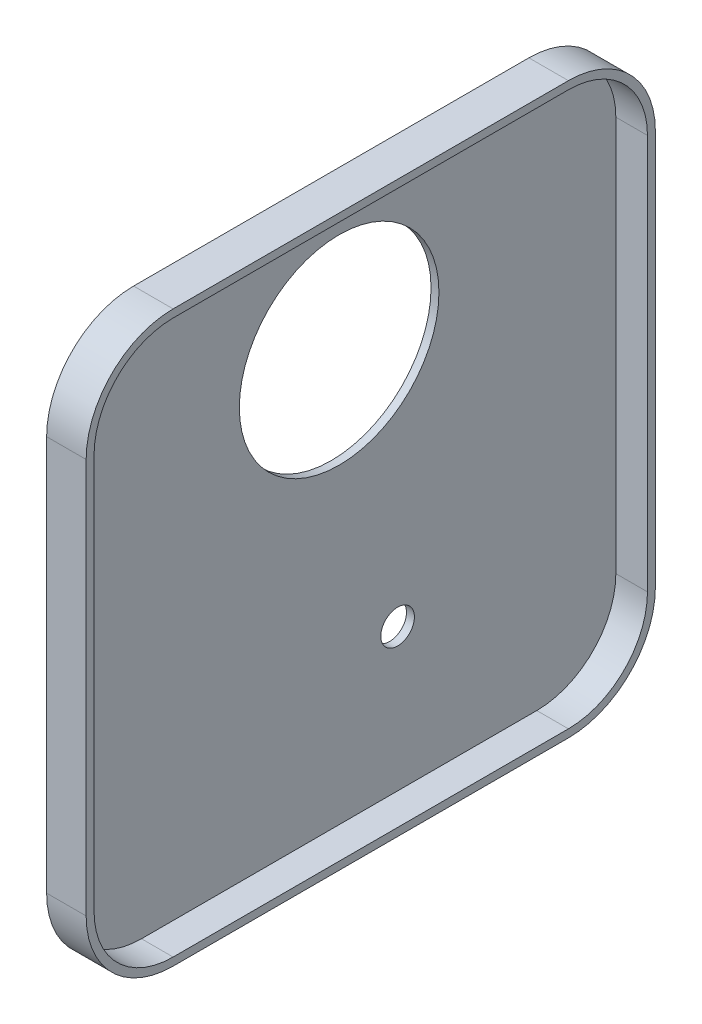
ISO-10303-21;
HEADER;
FILE_DESCRIPTION(('STEP AP214'),'2;1');
FILE_NAME('part.step','',(''),(''),'','','');
FILE_SCHEMA(('AUTOMOTIVE_DESIGN { 1 0 10303 214 1 1 1 1 }'));
ENDSEC;
DATA;
#1=APPLICATION_CONTEXT('core data for automotive mechanical design processes');
#2=APPLICATION_PROTOCOL_DEFINITION('international standard','automotive_design',2000,#1);
#3=PRODUCT_CONTEXT('',#1,'mechanical');
#4=PRODUCT('Part','Part','',(#3));
#5=PRODUCT_RELATED_PRODUCT_CATEGORY('part','',(#4));
#6=PRODUCT_DEFINITION_FORMATION('','',#4);
#7=PRODUCT_DEFINITION_CONTEXT('part definition',#1,'design');
#8=PRODUCT_DEFINITION('design','',#6,#7);
#9=PRODUCT_DEFINITION_SHAPE('','',#8);
#10=(LENGTH_UNIT() NAMED_UNIT(*) SI_UNIT(.MILLI.,.METRE.));
#11=(NAMED_UNIT(*) PLANE_ANGLE_UNIT() SI_UNIT($,.RADIAN.));
#12=(NAMED_UNIT(*) SI_UNIT($,.STERADIAN.) SOLID_ANGLE_UNIT());
#13=UNCERTAINTY_MEASURE_WITH_UNIT(LENGTH_MEASURE(1.E-05),#10,'distance_accuracy_value','');
#14=(GEOMETRIC_REPRESENTATION_CONTEXT(3) GLOBAL_UNCERTAINTY_ASSIGNED_CONTEXT((#13)) GLOBAL_UNIT_ASSIGNED_CONTEXT((#10,
#11,#12)) REPRESENTATION_CONTEXT('',''));
#15=CARTESIAN_POINT('',(0.,0.,0.));
#16=DIRECTION('',(0.,0.,1.));
#17=DIRECTION('',(1.,0.,0.));
#18=AXIS2_PLACEMENT_3D('',#15,#16,#17);
#19=CARTESIAN_POINT('',(10.,34.,0.));
#20=DIRECTION('',(-1.,0.,0.));
#21=DIRECTION('',(0.,0.,1.));
#22=AXIS2_PLACEMENT_3D('',#19,#20,#21);
#23=CYLINDRICAL_SURFACE('',#22,25.25);
#24=CARTESIAN_POINT('',(0.,34.,0.));
#25=DIRECTION('',(1.,0.,0.));
#26=DIRECTION('',(0.,0.,-1.));
#27=AXIS2_PLACEMENT_3D('',#24,#25,#26);
#28=CIRCLE('',#27,25.25);
#29=CARTESIAN_POINT('',(0.,34.,-25.25));
#30=VERTEX_POINT('',#29);
#31=EDGE_CURVE('E163',#30,#30,#28,.T.);
#32=ORIENTED_EDGE('',*,*,#31,.F.);
#33=EDGE_LOOP('',(#32));
#34=FACE_BOUND('',#33,.T.);
#35=CARTESIAN_POINT('',(2.,34.,0.));
#36=DIRECTION('',(1.,0.,0.));
#37=DIRECTION('',(0.,0.,-1.));
#38=AXIS2_PLACEMENT_3D('',#35,#36,#37);
#39=CIRCLE('',#38,25.25);
#40=CARTESIAN_POINT('',(2.,34.,-25.25));
#41=VERTEX_POINT('',#40);
#42=EDGE_CURVE('E326',#41,#41,#39,.T.);
#43=ORIENTED_EDGE('',*,*,#42,.T.);
#44=EDGE_LOOP('',(#43));
#45=FACE_BOUND('',#44,.T.);
#46=ADVANCED_FACE('F45',(#34,#45),#23,.F.);
#47=CARTESIAN_POINT('',(10.,-34.,-14.79));
#48=DIRECTION('',(-1.,0.,0.));
#49=DIRECTION('',(0.,0.,1.));
#50=AXIS2_PLACEMENT_3D('',#47,#48,#49);
#51=CYLINDRICAL_SURFACE('',#50,4.25);
#52=CARTESIAN_POINT('',(0.,-34.,-14.79));
#53=DIRECTION('',(1.,0.,0.));
#54=DIRECTION('',(0.,0.,-1.));
#55=AXIS2_PLACEMENT_3D('',#52,#53,#54);
#56=CIRCLE('',#55,4.25);
#57=CARTESIAN_POINT('',(0.,-34.,-19.04));
#58=VERTEX_POINT('',#57);
#59=EDGE_CURVE('E230',#58,#58,#56,.T.);
#60=ORIENTED_EDGE('',*,*,#59,.F.);
#61=EDGE_LOOP('',(#60));
#62=FACE_BOUND('',#61,.T.);
#63=CARTESIAN_POINT('',(2.,-34.,-14.79));
#64=DIRECTION('',(1.,0.,0.));
#65=DIRECTION('',(0.,0.,-1.));
#66=AXIS2_PLACEMENT_3D('',#63,#64,#65);
#67=CIRCLE('',#66,4.25);
#68=CARTESIAN_POINT('',(2.,-34.,-19.04));
#69=VERTEX_POINT('',#68);
#70=EDGE_CURVE('E330',#69,#69,#67,.T.);
#71=ORIENTED_EDGE('',*,*,#70,.T.);
#72=EDGE_LOOP('',(#71));
#73=FACE_BOUND('',#72,.T.);
#74=ADVANCED_FACE('F335',(#62,#73),#51,.F.);
#75=CARTESIAN_POINT('',(10.,-49.9999999999999,50.));
#76=DIRECTION('',(-1.,0.,0.));
#77=DIRECTION('',(0.,0.,1.));
#78=AXIS2_PLACEMENT_3D('',#75,#76,#77);
#79=PLANE('',#78);
#80=CARTESIAN_POINT('',(10.,-49.9999999999999,50.));
#81=DIRECTION('',(-1.,0.,0.));
#82=DIRECTION('',(0.,0.,1.));
#83=AXIS2_PLACEMENT_3D('',#80,#81,#82);
#84=CIRCLE('',#83,20.);
#85=CARTESIAN_POINT('',(10.,-49.9999999999999,70.));
#86=VERTEX_POINT('',#85);
#87=CARTESIAN_POINT('',(10.,-69.9999999999999,50.));
#88=VERTEX_POINT('',#87);
#89=EDGE_CURVE('E262',#86,#88,#84,.F.);
#90=ORIENTED_EDGE('',*,*,#89,.F.);
#91=DIRECTION('',(0.,-1.,0.));
#92=VECTOR('',#91,1.);
#93=CARTESIAN_POINT('',(10.,-49.9999999999999,70.));
#94=LINE('',#93,#92);
#95=CARTESIAN_POINT('',(10.,50.,70.));
#96=VERTEX_POINT('',#95);
#97=EDGE_CURVE('E235',#96,#86,#94,.T.);
#98=ORIENTED_EDGE('',*,*,#97,.F.);
#99=CARTESIAN_POINT('',(10.,50.,50.));
#100=DIRECTION('',(-1.,0.,0.));
#101=DIRECTION('',(0.,0.,1.));
#102=AXIS2_PLACEMENT_3D('',#99,#100,#101);
#103=CIRCLE('',#102,20.);
#104=CARTESIAN_POINT('',(10.,70.,50.));
#105=VERTEX_POINT('',#104);
#106=EDGE_CURVE('E239',#105,#96,#103,.F.);
#107=ORIENTED_EDGE('',*,*,#106,.F.);
#108=DIRECTION('',(0.,0.,1.));
#109=VECTOR('',#108,1.);
#110=CARTESIAN_POINT('',(10.,70.,50.));
#111=LINE('',#110,#109);
#112=CARTESIAN_POINT('',(10.,70.,-50.));
#113=VERTEX_POINT('',#112);
#114=EDGE_CURVE('E242',#113,#105,#111,.T.);
#115=ORIENTED_EDGE('',*,*,#114,.F.);
#116=CARTESIAN_POINT('',(10.,50.,-50.));
#117=DIRECTION('',(-1.,0.,0.));
#118=DIRECTION('',(0.,0.,1.));
#119=AXIS2_PLACEMENT_3D('',#116,#117,#118);
#120=CIRCLE('',#119,20.);
#121=CARTESIAN_POINT('',(10.,50.,-70.));
#122=VERTEX_POINT('',#121);
#123=EDGE_CURVE('E246',#122,#113,#120,.F.);
#124=ORIENTED_EDGE('',*,*,#123,.F.);
#125=DIRECTION('',(0.,1.,0.));
#126=VECTOR('',#125,1.);
#127=CARTESIAN_POINT('',(10.,-49.9999999999999,-70.));
#128=LINE('',#127,#126);
#129=CARTESIAN_POINT('',(10.,-49.9999999999999,-70.));
#130=VERTEX_POINT('',#129);
#131=EDGE_CURVE('E250',#130,#122,#128,.T.);
#132=ORIENTED_EDGE('',*,*,#131,.F.);
#133=CARTESIAN_POINT('',(10.,-49.9999999999999,-50.));
#134=DIRECTION('',(-1.,0.,0.));
#135=DIRECTION('',(0.,0.,1.));
#136=AXIS2_PLACEMENT_3D('',#133,#134,#135);
#137=CIRCLE('',#136,20.);
#138=CARTESIAN_POINT('',(10.,-69.9999999999999,-50.));
#139=VERTEX_POINT('',#138);
#140=EDGE_CURVE('E254',#139,#130,#137,.F.);
#141=ORIENTED_EDGE('',*,*,#140,.F.);
#142=DIRECTION('',(0.,0.,-1.));
#143=VECTOR('',#142,1.);
#144=CARTESIAN_POINT('',(10.,-69.9999999999999,50.));
#145=LINE('',#144,#143);
#146=EDGE_CURVE('E258',#88,#139,#145,.T.);
#147=ORIENTED_EDGE('',*,*,#146,.F.);
#148=EDGE_LOOP('',(#90,#98,#107,#115,#124,#132,#141,#147));
#149=FACE_BOUND('',#148,.T.);
#150=CARTESIAN_POINT('',(10.,-49.9999999999999,50.));
#151=DIRECTION('',(1.,0.,0.));
#152=DIRECTION('',(0.,0.,1.));
#153=AXIS2_PLACEMENT_3D('',#150,#151,#152);
#154=CIRCLE('',#153,22.);
#155=CARTESIAN_POINT('',(10.,-49.9999999999999,72.));
#156=VERTEX_POINT('',#155);
#157=CARTESIAN_POINT('',(10.,-71.9999999999999,50.));
#158=VERTEX_POINT('',#157);
#159=EDGE_CURVE('E182',#156,#158,#154,.T.);
#160=ORIENTED_EDGE('',*,*,#159,.T.);
#161=DIRECTION('',(0.,0.,-1.));
#162=VECTOR('',#161,1.);
#163=CARTESIAN_POINT('',(10.,-71.9999999999999,-50.));
#164=LINE('',#163,#162);
#165=CARTESIAN_POINT('',(10.,-71.9999999999999,-50.));
#166=VERTEX_POINT('',#165);
#167=EDGE_CURVE('E111',#158,#166,#164,.T.);
#168=ORIENTED_EDGE('',*,*,#167,.T.);
#169=CARTESIAN_POINT('',(10.,-49.9999999999999,-50.));
#170=DIRECTION('',(1.,0.,0.));
#171=DIRECTION('',(0.,0.,1.));
#172=AXIS2_PLACEMENT_3D('',#169,#170,#171);
#173=CIRCLE('',#172,22.);
#174=CARTESIAN_POINT('',(10.,-49.9999999999999,-72.));
#175=VERTEX_POINT('',#174);
#176=EDGE_CURVE('E203',#166,#175,#173,.T.);
#177=ORIENTED_EDGE('',*,*,#176,.T.);
#178=DIRECTION('',(0.,1.,0.));
#179=VECTOR('',#178,1.);
#180=CARTESIAN_POINT('',(10.,-49.9999999999999,-72.));
#181=LINE('',#180,#179);
#182=CARTESIAN_POINT('',(10.,50.,-72.));
#183=VERTEX_POINT('',#182);
#184=EDGE_CURVE('E217',#175,#183,#181,.T.);
#185=ORIENTED_EDGE('',*,*,#184,.T.);
#186=CARTESIAN_POINT('',(10.,50.,-50.));
#187=DIRECTION('',(1.,0.,0.));
#188=DIRECTION('',(0.,0.,-1.));
#189=AXIS2_PLACEMENT_3D('',#186,#187,#188);
#190=CIRCLE('',#189,22.);
#191=CARTESIAN_POINT('',(10.,72.,-50.));
#192=VERTEX_POINT('',#191);
#193=EDGE_CURVE('E133',#183,#192,#190,.T.);
#194=ORIENTED_EDGE('',*,*,#193,.T.);
#195=DIRECTION('',(0.,0.,1.));
#196=VECTOR('',#195,1.);
#197=CARTESIAN_POINT('',(10.,72.,-50.));
#198=LINE('',#197,#196);
#199=CARTESIAN_POINT('',(10.,72.,50.));
#200=VERTEX_POINT('',#199);
#201=EDGE_CURVE('E126',#192,#200,#198,.T.);
#202=ORIENTED_EDGE('',*,*,#201,.T.);
#203=CARTESIAN_POINT('',(10.,50.,50.));
#204=DIRECTION('',(1.,0.,0.));
#205=DIRECTION('',(0.,0.,1.));
#206=AXIS2_PLACEMENT_3D('',#203,#204,#205);
#207=CIRCLE('',#206,22.);
#208=CARTESIAN_POINT('',(10.,50.,72.));
#209=VERTEX_POINT('',#208);
#210=EDGE_CURVE('E130',#200,#209,#207,.T.);
#211=ORIENTED_EDGE('',*,*,#210,.T.);
#212=DIRECTION('',(0.,-1.,0.));
#213=VECTOR('',#212,1.);
#214=CARTESIAN_POINT('',(10.,-49.9999999999999,72.));
#215=LINE('',#214,#213);
#216=EDGE_CURVE('E70',#209,#156,#215,.T.);
#217=ORIENTED_EDGE('',*,*,#216,.T.);
#218=EDGE_LOOP('',(#160,#168,#177,#185,#194,#202,#211,#217));
#219=FACE_BOUND('',#218,.T.);
#220=ADVANCED_FACE('F128',(#149,#219),#79,.F.);
#221=CARTESIAN_POINT('',(0.,-49.9999999999999,50.));
#222=DIRECTION('',(-1.,0.,0.));
#223=DIRECTION('',(0.,0.,1.));
#224=AXIS2_PLACEMENT_3D('',#221,#222,#223);
#225=PLANE('',#224);
#226=ORIENTED_EDGE('',*,*,#31,.T.);
#227=EDGE_LOOP('',(#226));
#228=FACE_BOUND('',#227,.T.);
#229=CARTESIAN_POINT('',(0.,-49.9999999999999,50.));
#230=DIRECTION('',(1.,0.,0.));
#231=DIRECTION('',(0.,0.,1.));
#232=AXIS2_PLACEMENT_3D('',#229,#230,#231);
#233=CIRCLE('',#232,22.);
#234=CARTESIAN_POINT('',(0.,-49.9999999999999,72.));
#235=VERTEX_POINT('',#234);
#236=CARTESIAN_POINT('',(0.,-71.9999999999999,50.));
#237=VERTEX_POINT('',#236);
#238=EDGE_CURVE('E158',#235,#237,#233,.T.);
#239=ORIENTED_EDGE('',*,*,#238,.F.);
#240=DIRECTION('',(0.,-1.,0.));
#241=VECTOR('',#240,1.);
#242=CARTESIAN_POINT('',(0.,-49.9999999999999,72.));
#243=LINE('',#242,#241);
#244=CARTESIAN_POINT('',(0.,50.,72.));
#245=VERTEX_POINT('',#244);
#246=EDGE_CURVE('E103',#245,#235,#243,.T.);
#247=ORIENTED_EDGE('',*,*,#246,.F.);
#248=CARTESIAN_POINT('',(0.,50.,50.));
#249=DIRECTION('',(1.,0.,0.));
#250=DIRECTION('',(0.,0.,1.));
#251=AXIS2_PLACEMENT_3D('',#248,#249,#250);
#252=CIRCLE('',#251,22.);
#253=CARTESIAN_POINT('',(0.,72.,50.));
#254=VERTEX_POINT('',#253);
#255=EDGE_CURVE('E177',#254,#245,#252,.T.);
#256=ORIENTED_EDGE('',*,*,#255,.F.);
#257=DIRECTION('',(0.,0.,1.));
#258=VECTOR('',#257,1.);
#259=CARTESIAN_POINT('',(0.,72.,-50.));
#260=LINE('',#259,#258);
#261=CARTESIAN_POINT('',(0.,72.,-50.));
#262=VERTEX_POINT('',#261);
#263=EDGE_CURVE('E143',#262,#254,#260,.T.);
#264=ORIENTED_EDGE('',*,*,#263,.F.);
#265=CARTESIAN_POINT('',(0.,50.,-50.));
#266=DIRECTION('',(1.,0.,0.));
#267=DIRECTION('',(0.,0.,-1.));
#268=AXIS2_PLACEMENT_3D('',#265,#266,#267);
#269=CIRCLE('',#268,22.);
#270=CARTESIAN_POINT('',(0.,50.,-72.));
#271=VERTEX_POINT('',#270);
#272=EDGE_CURVE('E172',#271,#262,#269,.T.);
#273=ORIENTED_EDGE('',*,*,#272,.F.);
#274=DIRECTION('',(0.,1.,0.));
#275=VECTOR('',#274,1.);
#276=CARTESIAN_POINT('',(0.,-49.9999999999999,-72.));
#277=LINE('',#276,#275);
#278=CARTESIAN_POINT('',(0.,-49.9999999999999,-72.));
#279=VERTEX_POINT('',#278);
#280=EDGE_CURVE('E169',#279,#271,#277,.T.);
#281=ORIENTED_EDGE('',*,*,#280,.F.);
#282=CARTESIAN_POINT('',(0.,-49.9999999999999,-50.));
#283=DIRECTION('',(1.,0.,0.));
#284=DIRECTION('',(0.,0.,1.));
#285=AXIS2_PLACEMENT_3D('',#282,#283,#284);
#286=CIRCLE('',#285,22.);
#287=CARTESIAN_POINT('',(0.,-71.9999999999999,-50.));
#288=VERTEX_POINT('',#287);
#289=EDGE_CURVE('E166',#288,#279,#286,.T.);
#290=ORIENTED_EDGE('',*,*,#289,.F.);
#291=DIRECTION('',(0.,0.,-1.));
#292=VECTOR('',#291,1.);
#293=CARTESIAN_POINT('',(0.,-71.9999999999999,-50.));
#294=LINE('',#293,#292);
#295=EDGE_CURVE('E162',#237,#288,#294,.T.);
#296=ORIENTED_EDGE('',*,*,#295,.F.);
#297=EDGE_LOOP('',(#239,#247,#256,#264,#273,#281,#290,#296));
#298=FACE_BOUND('',#297,.T.);
#299=ORIENTED_EDGE('',*,*,#59,.T.);
#300=EDGE_LOOP('',(#299));
#301=FACE_BOUND('',#300,.T.);
#302=ADVANCED_FACE('F207',(#228,#298,#301),#225,.T.);
#303=CARTESIAN_POINT('',(10.,-49.9999999999999,50.));
#304=DIRECTION('',(-1.,0.,0.));
#305=DIRECTION('',(0.,0.,1.));
#306=AXIS2_PLACEMENT_3D('',#303,#304,#305);
#307=CYLINDRICAL_SURFACE('',#306,22.);
#308=ORIENTED_EDGE('',*,*,#238,.T.);
#309=DIRECTION('',(-1.,0.,0.));
#310=VECTOR('',#309,1.);
#311=CARTESIAN_POINT('',(10.,-71.9999999999999,50.));
#312=LINE('',#311,#310);
#313=EDGE_CURVE('E11',#158,#237,#312,.T.);
#314=ORIENTED_EDGE('',*,*,#313,.F.);
#315=ORIENTED_EDGE('',*,*,#159,.F.);
#316=DIRECTION('',(-1.,0.,0.));
#317=VECTOR('',#316,1.);
#318=CARTESIAN_POINT('',(10.,-49.9999999999999,72.));
#319=LINE('',#318,#317);
#320=EDGE_CURVE('E154',#156,#235,#319,.T.);
#321=ORIENTED_EDGE('',*,*,#320,.T.);
#322=EDGE_LOOP('',(#308,#314,#315,#321));
#323=FACE_BOUND('',#322,.T.);
#324=ADVANCED_FACE('F47',(#323),#307,.T.);
#325=CARTESIAN_POINT('',(10.,-71.9999999999999,-50.));
#326=DIRECTION('',(0.,1.,0.));
#327=DIRECTION('',(0.,0.,1.));
#328=AXIS2_PLACEMENT_3D('',#325,#326,#327);
#329=PLANE('',#328);
#330=ORIENTED_EDGE('',*,*,#295,.T.);
#331=DIRECTION('',(-1.,0.,0.));
#332=VECTOR('',#331,1.);
#333=CARTESIAN_POINT('',(10.,-71.9999999999999,-50.));
#334=LINE('',#333,#332);
#335=EDGE_CURVE('E54',#166,#288,#334,.T.);
#336=ORIENTED_EDGE('',*,*,#335,.F.);
#337=ORIENTED_EDGE('',*,*,#167,.F.);
#338=ORIENTED_EDGE('',*,*,#313,.T.);
#339=EDGE_LOOP('',(#330,#336,#337,#338));
#340=FACE_BOUND('',#339,.T.);
#341=ADVANCED_FACE('F375',(#340),#329,.F.);
#342=CARTESIAN_POINT('',(10.,-49.9999999999999,-50.));
#343=DIRECTION('',(-1.,0.,0.));
#344=DIRECTION('',(0.,0.,1.));
#345=AXIS2_PLACEMENT_3D('',#342,#343,#344);
#346=CYLINDRICAL_SURFACE('',#345,22.);
#347=ORIENTED_EDGE('',*,*,#289,.T.);
#348=DIRECTION('',(-1.,0.,0.));
#349=VECTOR('',#348,1.);
#350=CARTESIAN_POINT('',(10.,-49.9999999999999,-72.));
#351=LINE('',#350,#349);
#352=EDGE_CURVE('E193',#175,#279,#351,.T.);
#353=ORIENTED_EDGE('',*,*,#352,.F.);
#354=ORIENTED_EDGE('',*,*,#176,.F.);
#355=ORIENTED_EDGE('',*,*,#335,.T.);
#356=EDGE_LOOP('',(#347,#353,#354,#355));
#357=FACE_BOUND('',#356,.T.);
#358=ADVANCED_FACE('F201',(#357),#346,.T.);
#359=CARTESIAN_POINT('',(10.,-49.9999999999999,-72.));
#360=DIRECTION('',(0.,0.,1.));
#361=DIRECTION('',(1.,0.,0.));
#362=AXIS2_PLACEMENT_3D('',#359,#360,#361);
#363=PLANE('',#362);
#364=ORIENTED_EDGE('',*,*,#280,.T.);
#365=DIRECTION('',(-1.,0.,0.));
#366=VECTOR('',#365,1.);
#367=CARTESIAN_POINT('',(10.,50.,-72.));
#368=LINE('',#367,#366);
#369=EDGE_CURVE('E189',#183,#271,#368,.T.);
#370=ORIENTED_EDGE('',*,*,#369,.F.);
#371=ORIENTED_EDGE('',*,*,#184,.F.);
#372=ORIENTED_EDGE('',*,*,#352,.T.);
#373=EDGE_LOOP('',(#364,#370,#371,#372));
#374=FACE_BOUND('',#373,.T.);
#375=ADVANCED_FACE('F212',(#374),#363,.F.);
#376=CARTESIAN_POINT('',(10.,50.,-50.));
#377=DIRECTION('',(-1.,0.,0.));
#378=DIRECTION('',(0.,0.,1.));
#379=AXIS2_PLACEMENT_3D('',#376,#377,#378);
#380=CYLINDRICAL_SURFACE('',#379,22.);
#381=ORIENTED_EDGE('',*,*,#272,.T.);
#382=DIRECTION('',(-1.,0.,0.));
#383=VECTOR('',#382,1.);
#384=CARTESIAN_POINT('',(10.,72.,-50.));
#385=LINE('',#384,#383);
#386=EDGE_CURVE('E147',#192,#262,#385,.T.);
#387=ORIENTED_EDGE('',*,*,#386,.F.);
#388=ORIENTED_EDGE('',*,*,#193,.F.);
#389=ORIENTED_EDGE('',*,*,#369,.T.);
#390=EDGE_LOOP('',(#381,#387,#388,#389));
#391=FACE_BOUND('',#390,.T.);
#392=ADVANCED_FACE('F215',(#391),#380,.T.);
#393=CARTESIAN_POINT('',(10.,72.,-50.));
#394=DIRECTION('',(0.,-1.,0.));
#395=DIRECTION('',(0.,0.,-1.));
#396=AXIS2_PLACEMENT_3D('',#393,#394,#395);
#397=PLANE('',#396);
#398=ORIENTED_EDGE('',*,*,#263,.T.);
#399=DIRECTION('',(-1.,0.,0.));
#400=VECTOR('',#399,1.);
#401=CARTESIAN_POINT('',(10.,72.,50.));
#402=LINE('',#401,#400);
#403=EDGE_CURVE('E140',#200,#254,#402,.T.);
#404=ORIENTED_EDGE('',*,*,#403,.F.);
#405=ORIENTED_EDGE('',*,*,#201,.F.);
#406=ORIENTED_EDGE('',*,*,#386,.T.);
#407=EDGE_LOOP('',(#398,#404,#405,#406));
#408=FACE_BOUND('',#407,.T.);
#409=ADVANCED_FACE('F141',(#408),#397,.F.);
#410=CARTESIAN_POINT('',(10.,50.,50.));
#411=DIRECTION('',(-1.,0.,0.));
#412=DIRECTION('',(0.,0.,1.));
#413=AXIS2_PLACEMENT_3D('',#410,#411,#412);
#414=CYLINDRICAL_SURFACE('',#413,22.);
#415=ORIENTED_EDGE('',*,*,#255,.T.);
#416=DIRECTION('',(-1.,0.,0.));
#417=VECTOR('',#416,1.);
#418=CARTESIAN_POINT('',(10.,50.,72.));
#419=LINE('',#418,#417);
#420=EDGE_CURVE('E148',#209,#245,#419,.T.);
#421=ORIENTED_EDGE('',*,*,#420,.F.);
#422=ORIENTED_EDGE('',*,*,#210,.F.);
#423=ORIENTED_EDGE('',*,*,#403,.T.);
#424=EDGE_LOOP('',(#415,#421,#422,#423));
#425=FACE_BOUND('',#424,.T.);
#426=ADVANCED_FACE('F150',(#425),#414,.T.);
#427=CARTESIAN_POINT('',(10.,-49.9999999999999,72.));
#428=DIRECTION('',(0.,0.,-1.));
#429=DIRECTION('',(-1.,0.,0.));
#430=AXIS2_PLACEMENT_3D('',#427,#428,#429);
#431=PLANE('',#430);
#432=ORIENTED_EDGE('',*,*,#246,.T.);
#433=ORIENTED_EDGE('',*,*,#320,.F.);
#434=ORIENTED_EDGE('',*,*,#216,.F.);
#435=ORIENTED_EDGE('',*,*,#420,.T.);
#436=EDGE_LOOP('',(#432,#433,#434,#435));
#437=FACE_BOUND('',#436,.T.);
#438=ADVANCED_FACE('F341',(#437),#431,.F.);
#439=CARTESIAN_POINT('',(2.,-49.9999999999999,50.));
#440=DIRECTION('',(-1.,0.,0.));
#441=DIRECTION('',(0.,0.,1.));
#442=AXIS2_PLACEMENT_3D('',#439,#440,#441);
#443=PLANE('',#442);
#444=CARTESIAN_POINT('',(2.,-49.9999999999999,50.));
#445=DIRECTION('',(-1.,0.,0.));
#446=DIRECTION('',(0.,0.,1.));
#447=AXIS2_PLACEMENT_3D('',#444,#445,#446);
#448=CIRCLE('',#447,20.);
#449=CARTESIAN_POINT('',(2.,-49.9999999999999,70.));
#450=VERTEX_POINT('',#449);
#451=CARTESIAN_POINT('',(2.,-69.9999999999999,50.));
#452=VERTEX_POINT('',#451);
#453=EDGE_CURVE('E300',#450,#452,#448,.F.);
#454=ORIENTED_EDGE('',*,*,#453,.T.);
#455=DIRECTION('',(0.,0.,-1.));
#456=VECTOR('',#455,1.);
#457=CARTESIAN_POINT('',(2.,-69.9999999999999,50.));
#458=LINE('',#457,#456);
#459=CARTESIAN_POINT('',(2.,-69.9999999999999,-50.));
#460=VERTEX_POINT('',#459);
#461=EDGE_CURVE('E295',#452,#460,#458,.T.);
#462=ORIENTED_EDGE('',*,*,#461,.T.);
#463=CARTESIAN_POINT('',(2.,-49.9999999999999,-50.));
#464=DIRECTION('',(-1.,0.,0.));
#465=DIRECTION('',(0.,0.,1.));
#466=AXIS2_PLACEMENT_3D('',#463,#464,#465);
#467=CIRCLE('',#466,20.);
#468=CARTESIAN_POINT('',(2.,-49.9999999999999,-70.));
#469=VERTEX_POINT('',#468);
#470=EDGE_CURVE('E299',#460,#469,#467,.F.);
#471=ORIENTED_EDGE('',*,*,#470,.T.);
#472=DIRECTION('',(0.,1.,0.));
#473=VECTOR('',#472,1.);
#474=CARTESIAN_POINT('',(2.,-49.9999999999999,-70.));
#475=LINE('',#474,#473);
#476=CARTESIAN_POINT('',(2.,50.,-70.));
#477=VERTEX_POINT('',#476);
#478=EDGE_CURVE('E304',#469,#477,#475,.T.);
#479=ORIENTED_EDGE('',*,*,#478,.T.);
#480=CARTESIAN_POINT('',(2.,50.,-50.));
#481=DIRECTION('',(-1.,0.,0.));
#482=DIRECTION('',(0.,0.,1.));
#483=AXIS2_PLACEMENT_3D('',#480,#481,#482);
#484=CIRCLE('',#483,20.);
#485=CARTESIAN_POINT('',(2.,70.,-50.));
#486=VERTEX_POINT('',#485);
#487=EDGE_CURVE('E308',#477,#486,#484,.F.);
#488=ORIENTED_EDGE('',*,*,#487,.T.);
#489=DIRECTION('',(0.,0.,1.));
#490=VECTOR('',#489,1.);
#491=CARTESIAN_POINT('',(2.,70.,50.));
#492=LINE('',#491,#490);
#493=CARTESIAN_POINT('',(2.,70.,50.));
#494=VERTEX_POINT('',#493);
#495=EDGE_CURVE('E312',#486,#494,#492,.T.);
#496=ORIENTED_EDGE('',*,*,#495,.T.);
#497=CARTESIAN_POINT('',(2.,50.,50.));
#498=DIRECTION('',(-1.,0.,0.));
#499=DIRECTION('',(0.,0.,1.));
#500=AXIS2_PLACEMENT_3D('',#497,#498,#499);
#501=CIRCLE('',#500,20.);
#502=CARTESIAN_POINT('',(2.,50.,70.));
#503=VERTEX_POINT('',#502);
#504=EDGE_CURVE('E316',#494,#503,#501,.F.);
#505=ORIENTED_EDGE('',*,*,#504,.T.);
#506=DIRECTION('',(0.,-1.,0.));
#507=VECTOR('',#506,1.);
#508=CARTESIAN_POINT('',(2.,-49.9999999999999,70.));
#509=LINE('',#508,#507);
#510=EDGE_CURVE('E266',#503,#450,#509,.T.);
#511=ORIENTED_EDGE('',*,*,#510,.T.);
#512=EDGE_LOOP('',(#454,#462,#471,#479,#488,#496,#505,#511));
#513=FACE_BOUND('',#512,.T.);
#514=ORIENTED_EDGE('',*,*,#70,.F.);
#515=EDGE_LOOP('',(#514));
#516=FACE_BOUND('',#515,.T.);
#517=ORIENTED_EDGE('',*,*,#42,.F.);
#518=EDGE_LOOP('',(#517));
#519=FACE_BOUND('',#518,.T.);
#520=ADVANCED_FACE('F337',(#513,#516,#519),#443,.F.);
#521=CARTESIAN_POINT('',(10.,-49.9999999999999,50.));
#522=DIRECTION('',(-1.,0.,0.));
#523=DIRECTION('',(0.,0.,1.));
#524=AXIS2_PLACEMENT_3D('',#521,#522,#523);
#525=CYLINDRICAL_SURFACE('',#524,20.);
#526=ORIENTED_EDGE('',*,*,#453,.F.);
#527=DIRECTION('',(-1.,0.,0.));
#528=VECTOR('',#527,1.);
#529=CARTESIAN_POINT('',(10.,-49.9999999999999,70.));
#530=LINE('',#529,#528);
#531=EDGE_CURVE('E238',#86,#450,#530,.T.);
#532=ORIENTED_EDGE('',*,*,#531,.F.);
#533=ORIENTED_EDGE('',*,*,#89,.T.);
#534=DIRECTION('',(1.,0.,0.));
#535=VECTOR('',#534,1.);
#536=CARTESIAN_POINT('',(10.,-69.9999999999999,50.));
#537=LINE('',#536,#535);
#538=EDGE_CURVE('E234',#88,#452,#537,.F.);
#539=ORIENTED_EDGE('',*,*,#538,.T.);
#540=EDGE_LOOP('',(#526,#532,#533,#539));
#541=FACE_BOUND('',#540,.T.);
#542=ADVANCED_FACE('F340',(#541),#525,.F.);
#543=CARTESIAN_POINT('',(10.,-69.9999999999999,-50.));
#544=DIRECTION('',(0.,1.,0.));
#545=DIRECTION('',(0.,0.,1.));
#546=AXIS2_PLACEMENT_3D('',#543,#544,#545);
#547=PLANE('',#546);
#548=ORIENTED_EDGE('',*,*,#461,.F.);
#549=ORIENTED_EDGE('',*,*,#538,.F.);
#550=ORIENTED_EDGE('',*,*,#146,.T.);
#551=DIRECTION('',(-1.,0.,0.));
#552=VECTOR('',#551,1.);
#553=CARTESIAN_POINT('',(10.,-69.9999999999999,-50.));
#554=LINE('',#553,#552);
#555=EDGE_CURVE('E285',#139,#460,#554,.T.);
#556=ORIENTED_EDGE('',*,*,#555,.T.);
#557=EDGE_LOOP('',(#548,#549,#550,#556));
#558=FACE_BOUND('',#557,.T.);
#559=ADVANCED_FACE('F406',(#558),#547,.T.);
#560=CARTESIAN_POINT('',(10.,-49.9999999999999,-50.));
#561=DIRECTION('',(-1.,0.,0.));
#562=DIRECTION('',(0.,0.,1.));
#563=AXIS2_PLACEMENT_3D('',#560,#561,#562);
#564=CYLINDRICAL_SURFACE('',#563,20.);
#565=ORIENTED_EDGE('',*,*,#470,.F.);
#566=ORIENTED_EDGE('',*,*,#555,.F.);
#567=ORIENTED_EDGE('',*,*,#140,.T.);
#568=DIRECTION('',(1.,0.,0.));
#569=VECTOR('',#568,1.);
#570=CARTESIAN_POINT('',(10.,-49.9999999999999,-70.));
#571=LINE('',#570,#569);
#572=EDGE_CURVE('E281',#130,#469,#571,.F.);
#573=ORIENTED_EDGE('',*,*,#572,.T.);
#574=EDGE_LOOP('',(#565,#566,#567,#573));
#575=FACE_BOUND('',#574,.T.);
#576=ADVANCED_FACE('F416',(#575),#564,.F.);
#577=CARTESIAN_POINT('',(10.,-49.9999999999999,-70.));
#578=DIRECTION('',(0.,0.,1.));
#579=DIRECTION('',(1.,0.,0.));
#580=AXIS2_PLACEMENT_3D('',#577,#578,#579);
#581=PLANE('',#580);
#582=ORIENTED_EDGE('',*,*,#478,.F.);
#583=ORIENTED_EDGE('',*,*,#572,.F.);
#584=ORIENTED_EDGE('',*,*,#131,.T.);
#585=DIRECTION('',(-1.,0.,0.));
#586=VECTOR('',#585,1.);
#587=CARTESIAN_POINT('',(10.,50.,-70.));
#588=LINE('',#587,#586);
#589=EDGE_CURVE('E277',#122,#477,#588,.T.);
#590=ORIENTED_EDGE('',*,*,#589,.T.);
#591=EDGE_LOOP('',(#582,#583,#584,#590));
#592=FACE_BOUND('',#591,.T.);
#593=ADVANCED_FACE('F425',(#592),#581,.T.);
#594=CARTESIAN_POINT('',(10.,50.,-50.));
#595=DIRECTION('',(-1.,0.,0.));
#596=DIRECTION('',(0.,0.,1.));
#597=AXIS2_PLACEMENT_3D('',#594,#595,#596);
#598=CYLINDRICAL_SURFACE('',#597,20.);
#599=ORIENTED_EDGE('',*,*,#487,.F.);
#600=ORIENTED_EDGE('',*,*,#589,.F.);
#601=ORIENTED_EDGE('',*,*,#123,.T.);
#602=DIRECTION('',(1.,0.,0.));
#603=VECTOR('',#602,1.);
#604=CARTESIAN_POINT('',(10.,70.,-50.));
#605=LINE('',#604,#603);
#606=EDGE_CURVE('E273',#113,#486,#605,.F.);
#607=ORIENTED_EDGE('',*,*,#606,.T.);
#608=EDGE_LOOP('',(#599,#600,#601,#607));
#609=FACE_BOUND('',#608,.T.);
#610=ADVANCED_FACE('F434',(#609),#598,.F.);
#611=CARTESIAN_POINT('',(10.,70.,-50.));
#612=DIRECTION('',(0.,-1.,0.));
#613=DIRECTION('',(0.,0.,-1.));
#614=AXIS2_PLACEMENT_3D('',#611,#612,#613);
#615=PLANE('',#614);
#616=ORIENTED_EDGE('',*,*,#495,.F.);
#617=ORIENTED_EDGE('',*,*,#606,.F.);
#618=ORIENTED_EDGE('',*,*,#114,.T.);
#619=DIRECTION('',(-1.,0.,0.));
#620=VECTOR('',#619,1.);
#621=CARTESIAN_POINT('',(10.,70.,50.));
#622=LINE('',#621,#620);
#623=EDGE_CURVE('E269',#105,#494,#622,.T.);
#624=ORIENTED_EDGE('',*,*,#623,.T.);
#625=EDGE_LOOP('',(#616,#617,#618,#624));
#626=FACE_BOUND('',#625,.T.);
#627=ADVANCED_FACE('F443',(#626),#615,.T.);
#628=CARTESIAN_POINT('',(10.,50.,50.));
#629=DIRECTION('',(-1.,0.,0.));
#630=DIRECTION('',(0.,0.,1.));
#631=AXIS2_PLACEMENT_3D('',#628,#629,#630);
#632=CYLINDRICAL_SURFACE('',#631,20.);
#633=ORIENTED_EDGE('',*,*,#504,.F.);
#634=ORIENTED_EDGE('',*,*,#623,.F.);
#635=ORIENTED_EDGE('',*,*,#106,.T.);
#636=DIRECTION('',(-1.,0.,0.));
#637=VECTOR('',#636,1.);
#638=CARTESIAN_POINT('',(10.,50.,70.));
#639=LINE('',#638,#637);
#640=EDGE_CURVE('E61',#96,#503,#639,.T.);
#641=ORIENTED_EDGE('',*,*,#640,.T.);
#642=EDGE_LOOP('',(#633,#634,#635,#641));
#643=FACE_BOUND('',#642,.T.);
#644=ADVANCED_FACE('F452',(#643),#632,.F.);
#645=CARTESIAN_POINT('',(10.,-49.9999999999999,70.));
#646=DIRECTION('',(0.,0.,-1.));
#647=DIRECTION('',(-1.,0.,0.));
#648=AXIS2_PLACEMENT_3D('',#645,#646,#647);
#649=PLANE('',#648);
#650=ORIENTED_EDGE('',*,*,#510,.F.);
#651=ORIENTED_EDGE('',*,*,#640,.F.);
#652=ORIENTED_EDGE('',*,*,#97,.T.);
#653=ORIENTED_EDGE('',*,*,#531,.T.);
#654=EDGE_LOOP('',(#650,#651,#652,#653));
#655=FACE_BOUND('',#654,.T.);
#656=ADVANCED_FACE('F460',(#655),#649,.T.);
#657=CLOSED_SHELL('',(#46,#74,#220,#302,#324,#341,#358,#375,#392,#409,#426,#438,#520,#542,#559,
#576,#593,#610,#627,#644,#656));
#658=MANIFOLD_SOLID_BREP('B2',#657);
#659=ADVANCED_BREP_SHAPE_REPRESENTATION('',(#18,#658),#14);
#660=SHAPE_DEFINITION_REPRESENTATION(#9,#659);
ENDSEC;
END-ISO-10303-21;
